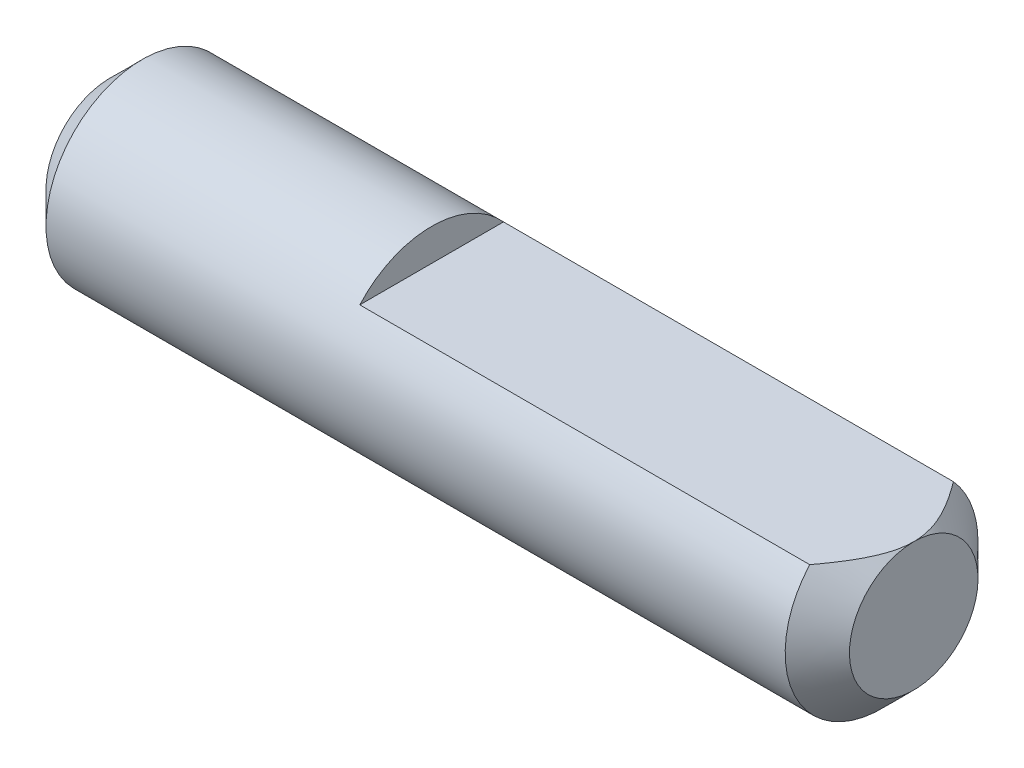
ISO-10303-21;
HEADER;
FILE_DESCRIPTION(('STEP AP214'),'2;1');
FILE_NAME('part.step','',(''),(''),'','','');
FILE_SCHEMA(('AUTOMOTIVE_DESIGN { 1 0 10303 214 1 1 1 1 }'));
ENDSEC;
DATA;
#1=APPLICATION_CONTEXT('core data for automotive mechanical design processes');
#2=APPLICATION_PROTOCOL_DEFINITION('international standard','automotive_design',2000,#1);
#3=PRODUCT_CONTEXT('',#1,'mechanical');
#4=PRODUCT('Part','Part','',(#3));
#5=PRODUCT_RELATED_PRODUCT_CATEGORY('part','',(#4));
#6=PRODUCT_DEFINITION_FORMATION('','',#4);
#7=PRODUCT_DEFINITION_CONTEXT('part definition',#1,'design');
#8=PRODUCT_DEFINITION('design','',#6,#7);
#9=PRODUCT_DEFINITION_SHAPE('','',#8);
#10=(LENGTH_UNIT() NAMED_UNIT(*) SI_UNIT(.MILLI.,.METRE.));
#11=(NAMED_UNIT(*) PLANE_ANGLE_UNIT() SI_UNIT($,.RADIAN.));
#12=(NAMED_UNIT(*) SI_UNIT($,.STERADIAN.) SOLID_ANGLE_UNIT());
#13=UNCERTAINTY_MEASURE_WITH_UNIT(LENGTH_MEASURE(1.E-05),#10,'distance_accuracy_value','');
#14=(GEOMETRIC_REPRESENTATION_CONTEXT(3) GLOBAL_UNCERTAINTY_ASSIGNED_CONTEXT((#13)) GLOBAL_UNIT_ASSIGNED_CONTEXT((#10,
#11,#12)) REPRESENTATION_CONTEXT('',''));
#15=CARTESIAN_POINT('',(0.,0.,0.));
#16=DIRECTION('',(0.,0.,1.));
#17=DIRECTION('',(1.,0.,0.));
#18=AXIS2_PLACEMENT_3D('',#15,#16,#17);
#19=CARTESIAN_POINT('',(-12.5,0.,0.));
#20=DIRECTION('',(-1.,0.,0.));
#21=DIRECTION('',(0.,0.,-1.));
#22=AXIS2_PLACEMENT_3D('',#19,#20,#21);
#23=PLANE('',#22);
#24=CARTESIAN_POINT('',(-12.5,0.,0.));
#25=DIRECTION('',(1.,0.,0.));
#26=DIRECTION('',(0.,0.,-1.));
#27=AXIS2_PLACEMENT_3D('',#24,#25,#26);
#28=CIRCLE('',#27,1.99999999999999);
#29=CARTESIAN_POINT('',(-12.5,0.,-1.99999999999999));
#30=VERTEX_POINT('',#29);
#31=EDGE_CURVE('E85',#30,#30,#28,.T.);
#32=ORIENTED_EDGE('',*,*,#31,.F.);
#33=EDGE_LOOP('',(#32));
#34=FACE_BOUND('',#33,.T.);
#35=ADVANCED_FACE('F41',(#34),#23,.T.);
#36=CARTESIAN_POINT('',(12.5,0.,0.));
#37=DIRECTION('',(-1.,0.,0.));
#38=DIRECTION('',(0.,0.,-1.));
#39=AXIS2_PLACEMENT_3D('',#36,#37,#38);
#40=PLANE('',#39);
#41=CARTESIAN_POINT('',(12.5,0.,0.));
#42=DIRECTION('',(1.,0.,0.));
#43=DIRECTION('',(0.,0.,-1.));
#44=AXIS2_PLACEMENT_3D('',#41,#42,#43);
#45=CIRCLE('',#44,1.99999999999999);
#46=CARTESIAN_POINT('',(12.5,2.,0.));
#47=VERTEX_POINT('',#46);
#48=EDGE_CURVE('E94',#47,#47,#45,.F.);
#49=ORIENTED_EDGE('',*,*,#48,.F.);
#50=EDGE_LOOP('',(#49));
#51=FACE_BOUND('',#50,.T.);
#52=ADVANCED_FACE('F109',(#51),#40,.F.);
#53=CARTESIAN_POINT('',(-12.5,0.,0.));
#54=DIRECTION('',(-1.,0.,0.));
#55=DIRECTION('',(0.,0.,-1.));
#56=AXIS2_PLACEMENT_3D('',#53,#54,#55);
#57=CYLINDRICAL_SURFACE('',#56,3.);
#58=DIRECTION('',(-1.,0.,0.));
#59=VECTOR('',#58,1.);
#60=CARTESIAN_POINT('',(-12.5,2.,2.23606797749979));
#61=LINE('',#60,#59);
#62=CARTESIAN_POINT('',(11.4999999999999,2.,2.23606797749999));
#63=VERTEX_POINT('',#62);
#64=CARTESIAN_POINT('',(-2.5,2.,2.23606797749979));
#65=VERTEX_POINT('',#64);
#66=EDGE_CURVE('E73',#63,#65,#61,.T.);
#67=ORIENTED_EDGE('',*,*,#66,.T.);
#68=CARTESIAN_POINT('',(-2.5,0.,0.));
#69=DIRECTION('',(1.,0.,0.));
#70=DIRECTION('',(0.,0.,-1.));
#71=AXIS2_PLACEMENT_3D('',#68,#69,#70);
#72=CIRCLE('',#71,3.);
#73=CARTESIAN_POINT('',(-2.5,2.,-2.23606797749979));
#74=VERTEX_POINT('',#73);
#75=EDGE_CURVE('E11',#65,#74,#72,.F.);
#76=ORIENTED_EDGE('',*,*,#75,.T.);
#77=DIRECTION('',(-1.,0.,0.));
#78=VECTOR('',#77,1.);
#79=CARTESIAN_POINT('',(-12.5,2.,-2.23606797749979));
#80=LINE('',#79,#78);
#81=CARTESIAN_POINT('',(11.4999999999996,2.,-2.23606797750084));
#82=VERTEX_POINT('',#81);
#83=EDGE_CURVE('E75',#74,#82,#80,.F.);
#84=ORIENTED_EDGE('',*,*,#83,.T.);
#85=CARTESIAN_POINT('',(11.5,0.,0.));
#86=DIRECTION('',(1.,0.,0.));
#87=DIRECTION('',(0.,0.,-1.));
#88=AXIS2_PLACEMENT_3D('',#85,#86,#87);
#89=CIRCLE('',#88,3.);
#90=EDGE_CURVE('E83',#63,#82,#89,.T.);
#91=ORIENTED_EDGE('',*,*,#90,.F.);
#92=EDGE_LOOP('',(#67,#76,#84,#91));
#93=FACE_BOUND('',#92,.T.);
#94=CARTESIAN_POINT('',(-11.5,0.,0.));
#95=DIRECTION('',(1.,0.,0.));
#96=DIRECTION('',(0.,0.,-1.));
#97=AXIS2_PLACEMENT_3D('',#94,#95,#96);
#98=CIRCLE('',#97,3.);
#99=CARTESIAN_POINT('',(-11.5,0.,-3.));
#100=VERTEX_POINT('',#99);
#101=EDGE_CURVE('E91',#100,#100,#98,.F.);
#102=ORIENTED_EDGE('',*,*,#101,.F.);
#103=EDGE_LOOP('',(#102));
#104=FACE_BOUND('',#103,.T.);
#105=ADVANCED_FACE('F81',(#93,#104),#57,.T.);
#106=CARTESIAN_POINT('',(-12.5,0.,0.));
#107=DIRECTION('',(1.,0.,0.));
#108=DIRECTION('',(0.,0.,1.));
#109=AXIS2_PLACEMENT_3D('',#106,#107,#108);
#110=CONICAL_SURFACE('',#109,1.99999999999999,0.785398163397446);
#111=ORIENTED_EDGE('',*,*,#101,.T.);
#112=EDGE_LOOP('',(#111));
#113=FACE_BOUND('',#112,.T.);
#114=ORIENTED_EDGE('',*,*,#31,.T.);
#115=EDGE_LOOP('',(#114));
#116=FACE_BOUND('',#115,.T.);
#117=ADVANCED_FACE('F108',(#113,#116),#110,.T.);
#118=CARTESIAN_POINT('',(11.5,0.,0.));
#119=DIRECTION('',(-1.,0.,0.));
#120=DIRECTION('',(0.,0.,-1.));
#121=AXIS2_PLACEMENT_3D('',#118,#119,#120);
#122=CONICAL_SURFACE('',#121,3.,0.78539816339745);
#123=CARTESIAN_POINT('',(5.41703746970178,2.,-8.86003432988845));
#124=CARTESIAN_POINT('',(5.65772775587966,2.,-8.61326628181268));
#125=CARTESIAN_POINT('',(5.89818932126684,2.,-8.36627412238222));
#126=CARTESIAN_POINT('',(6.37847537945591,2.,-7.87164272525134));
#127=CARTESIAN_POINT('',(6.6182998334215,2.,-7.62400344985071));
#128=CARTESIAN_POINT('',(7.09766753113925,2.,-7.12732372928553));
#129=CARTESIAN_POINT('',(7.33720877992833,2.,-6.87828135734135));
#130=CARTESIAN_POINT('',(7.81511816843588,2.,-6.37909579449285));
#131=CARTESIAN_POINT('',(8.05348636554827,2.,-6.12895265860308));
#132=CARTESIAN_POINT('',(8.53862729701263,2.,-5.61649990414109));
#133=CARTESIAN_POINT('',(8.7853291560252,2.,-5.35412312822613));
#134=CARTESIAN_POINT('',(9.27611212193805,2.,-4.82684278662519));
#135=CARTESIAN_POINT('',(9.52019282034569,2.,-4.56193883890144));
#136=CARTESIAN_POINT('',(9.88292375229358,2.,-4.16179105350155));
#137=CARTESIAN_POINT('',(10.0031996958733,2.,-4.02802218949267));
#138=CARTESIAN_POINT('',(10.2423168430769,2.,-3.75920971084084));
#139=CARTESIAN_POINT('',(10.3611580738999,2.,-3.62416612045073));
#140=CARTESIAN_POINT('',(10.5968866585208,2.,-3.35244082891347));
#141=CARTESIAN_POINT('',(10.7137744962098,2.,-3.21575954830017));
#142=CARTESIAN_POINT('',(10.9448790700268,2.,-2.94016178485181));
#143=CARTESIAN_POINT('',(11.0590960369023,2.,-2.80124549687175));
#144=CARTESIAN_POINT('',(11.2134470954143,2.,-2.60814461422931));
#145=CARTESIAN_POINT('',(11.2552476939882,2.,-2.55529185212358));
#146=CARTESIAN_POINT('',(11.3382090653509,2.,-2.44908586095818));
#147=CARTESIAN_POINT('',(11.3793698296002,2.,-2.39573262523426));
#148=CARTESIAN_POINT('',(11.5017621522644,2.,-2.23479455060442));
#149=CARTESIAN_POINT('',(11.5818831700971,2.,-2.12635689306305));
#150=CARTESIAN_POINT('',(11.7378134006537,2.,-1.90673708759311));
#151=CARTESIAN_POINT('',(11.8136310124631,2.,-1.79556093890677));
#152=CARTESIAN_POINT('',(11.9592648130628,2.,-1.56934886975337));
#153=CARTESIAN_POINT('',(12.0290838591124,2.,-1.45431482360752));
#154=CARTESIAN_POINT('',(12.130385368316,2.,-1.27198493066234));
#155=CARTESIAN_POINT('',(12.1650047648803,2.,-1.20644698594879));
#156=CARTESIAN_POINT('',(12.230766898565,2.,-1.07366673449259));
#157=CARTESIAN_POINT('',(12.2619093348087,2.,-1.00642428086809));
#158=CARTESIAN_POINT('',(12.348677331037,2.,-0.802077686015743));
#159=CARTESIAN_POINT('',(12.3978656324703,2.,-0.661975190878664));
#160=CARTESIAN_POINT('',(12.4482825520442,2.,-0.461135646716724));
#161=CARTESIAN_POINT('',(12.4605900319976,2.,-0.403129036486597));
#162=CARTESIAN_POINT('',(12.4804283252132,2.,-0.28631420468672));
#163=CARTESIAN_POINT('',(12.4879614987479,2.,-0.227506393918163));
#164=CARTESIAN_POINT('',(12.4978620338104,2.,-0.109558488665088));
#165=CARTESIAN_POINT('',(12.5002385683149,2.,-0.0504191721513691));
#166=CARTESIAN_POINT('',(12.4997235027777,2.,0.0678384914660358));
#167=CARTESIAN_POINT('',(12.4968317495754,2.,0.126956837910099));
#168=CARTESIAN_POINT('',(12.4859567501784,2.,0.244510879048098));
#169=CARTESIAN_POINT('',(12.4779910262056,2.,0.302948221036442));
#170=CARTESIAN_POINT('',(12.457380920399,2.,0.41899444563337));
#171=CARTESIAN_POINT('',(12.4447354297561,2.,0.476603128538789));
#172=CARTESIAN_POINT('',(12.4152693597724,2.,0.590898805262331));
#173=CARTESIAN_POINT('',(12.3984374104437,2.,0.64758283355783));
#174=CARTESIAN_POINT('',(12.3612099218623,2.,0.759751791832215));
#175=CARTESIAN_POINT('',(12.3408145343484,2.,0.815236772756141));
#176=CARTESIAN_POINT('',(12.2879608282142,2.,0.947727233807935));
#177=CARTESIAN_POINT('',(12.2540040015544,2.,1.02413301767514));
#178=CARTESIAN_POINT('',(12.1814592727722,2.,1.17472930717663));
#179=CARTESIAN_POINT('',(12.142868803118,2.,1.24891855591839));
#180=CARTESIAN_POINT('',(12.062053667377,2.,1.3954657814648));
#181=CARTESIAN_POINT('',(12.0198220005083,2.,1.46781986812049));
#182=CARTESIAN_POINT('',(11.932588859845,2.,1.61084154933759));
#183=CARTESIAN_POINT('',(11.8875869724692,2.,1.6815088898794));
#184=CARTESIAN_POINT('',(11.7947414327508,2.,1.82243628031244));
#185=CARTESIAN_POINT('',(11.7468657769217,2.,1.8926751476593));
#186=CARTESIAN_POINT('',(11.6493489269364,2.,2.03191523170228));
#187=CARTESIAN_POINT('',(11.5997076704431,2.,2.10091640457012));
#188=CARTESIAN_POINT('',(11.4990773821634,2.,2.23778591963137));
#189=CARTESIAN_POINT('',(11.4480902132908,2.,2.30565563523325));
#190=CARTESIAN_POINT('',(11.3449692411205,2.,2.44051239160787));
#191=CARTESIAN_POINT('',(11.292835476495,2.,2.50749946202879));
#192=CARTESIAN_POINT('',(11.1232507476965,2.,2.72226884836498));
#193=CARTESIAN_POINT('',(11.0039525442269,2.,2.86859218788451));
#194=CARTESIAN_POINT('',(10.7622538964127,2.,3.15866002674973));
#195=CARTESIAN_POINT('',(10.6398531075473,2.,3.30240423664722));
#196=CARTESIAN_POINT('',(10.3928234816083,2.,3.58804149156583));
#197=CARTESIAN_POINT('',(10.2681939474629,2.,3.72993393254005));
#198=CARTESIAN_POINT('',(10.017329582773,2.,4.01229443801337));
#199=CARTESIAN_POINT('',(9.89109471582817,2.,4.15276247008415));
#200=CARTESIAN_POINT('',(9.5101641473369,2.,4.57303156086122));
#201=CARTESIAN_POINT('',(9.25367422062177,2.,4.85120466112473));
#202=CARTESIAN_POINT('',(8.73787881132942,2.,5.40481331464448));
#203=CARTESIAN_POINT('',(8.47857388539581,2.,5.68024938921235));
#204=CARTESIAN_POINT('',(7.98660997655898,2.,6.19921659830033));
#205=CARTESIAN_POINT('',(7.75414738426389,2.,6.44293407084752));
#206=CARTESIAN_POINT('',(7.28813095964181,2.,6.92935046958473));
#207=CARTESIAN_POINT('',(7.05457706255781,2.,7.17204933366686));
#208=CARTESIAN_POINT('',(6.58735875199387,2.,7.65596926208179));
#209=CARTESIAN_POINT('',(6.35369666350206,2.,7.89719257267554));
#210=CARTESIAN_POINT('',(5.88577496049427,2.,8.37902662777462));
#211=CARTESIAN_POINT('',(5.65151538850262,2.,8.61963741356644));
#212=CARTESIAN_POINT('',(5.41703746970178,2.,8.86003432988845));
#213=B_SPLINE_CURVE_WITH_KNOTS('',3,(#123,#124,#125,#126,#127,#128,#129,#130,#131,#132,#133,
#134,#135,#136,#137,#138,#139,#140,#141,#142,#143,#144,#145,#146,#147,#148,#149,#150,#151,#152,
#153,#154,#155,#156,#157,#158,#159,#160,#161,#162,#163,#164,#165,#166,#167,#168,#169,#170,#171,
#172,#173,#174,#175,#176,#177,#178,#179,#180,#181,#182,#183,#184,#185,#186,#187,#188,#189,#190,
#191,#192,#193,#194,#195,#196,#197,#198,#199,#200,#201,#202,#203,#204,#205,#206,#207,#208,#209,
#210,#211,#212),.UNSPECIFIED.,.F.,.F.,(4,2,2,2,2,2,2,2,2,2,2,2,2,2,2,2,2,2,2,2,2,2,2,2,2,2,2,2,
2,2,2,2,2,2,2,2,2,2,2,2,2,2,2,2,4),(0.,1.03413662075917,2.06833489563741,3.10497064258256,
4.14155515546503,5.22197638861575,6.30256362442557,6.84222642641263,7.3818789814386,
7.92139581157559,8.46086585711346,8.66301571388498,8.86516826629999,9.26957174594646,
9.67315669128106,10.076548321242,10.2988071281946,10.5210851533016,10.9643291236505,
11.1420628138381,11.3197085691929,11.4970380563588,11.6743726989632,11.8510982379089,
12.0278656764793,12.2051185420217,12.382363861591,12.6329835111957,12.8837426772573,
13.1349952037894,13.3862853325664,13.6412618216769,13.896247322065,14.150896697606,
14.4055374975173,14.9718400725797,15.538205809547,16.1047518958526,16.6713108514056,
17.8063943211659,18.9412572839372,19.9516651237309,20.962133701529,21.9696442456258,
22.9770849794664),.UNSPECIFIED.);
#214=EDGE_CURVE('E50',#82,#47,#213,.T.);
#215=ORIENTED_EDGE('',*,*,#214,.T.);
#216=ORIENTED_EDGE('',*,*,#48,.T.);
#217=EDGE_CURVE('E57',#47,#63,#213,.T.);
#218=ORIENTED_EDGE('',*,*,#217,.T.);
#219=ORIENTED_EDGE('',*,*,#90,.T.);
#220=EDGE_LOOP('',(#215,#216,#218,#219));
#221=FACE_BOUND('',#220,.T.);
#222=ADVANCED_FACE('F43',(#221),#122,.T.);
#223=CARTESIAN_POINT('',(12.5,2.,3.));
#224=DIRECTION('',(0.,-1.,0.));
#225=DIRECTION('',(1.,0.,0.));
#226=AXIS2_PLACEMENT_3D('',#223,#224,#225);
#227=PLANE('',#226);
#228=ORIENTED_EDGE('',*,*,#83,.F.);
#229=DIRECTION('',(0.,0.,-1.));
#230=VECTOR('',#229,1.);
#231=CARTESIAN_POINT('',(-2.5,2.,3.));
#232=LINE('',#231,#230);
#233=EDGE_CURVE('E69',#65,#74,#232,.T.);
#234=ORIENTED_EDGE('',*,*,#233,.F.);
#235=ORIENTED_EDGE('',*,*,#66,.F.);
#236=ORIENTED_EDGE('',*,*,#217,.F.);
#237=ORIENTED_EDGE('',*,*,#214,.F.);
#238=EDGE_LOOP('',(#228,#234,#235,#236,#237));
#239=FACE_BOUND('',#238,.T.);
#240=ADVANCED_FACE('F71',(#239),#227,.F.);
#241=CARTESIAN_POINT('',(-2.5,2.,3.));
#242=DIRECTION('',(-1.,0.,0.));
#243=DIRECTION('',(0.,0.,-1.));
#244=AXIS2_PLACEMENT_3D('',#241,#242,#243);
#245=PLANE('',#244);
#246=ORIENTED_EDGE('',*,*,#233,.T.);
#247=ORIENTED_EDGE('',*,*,#75,.F.);
#248=EDGE_LOOP('',(#246,#247));
#249=FACE_BOUND('',#248,.T.);
#250=ADVANCED_FACE('F78',(#249),#245,.F.);
#251=CLOSED_SHELL('',(#35,#52,#105,#117,#222,#240,#250));
#252=MANIFOLD_SOLID_BREP('B2',#251);
#253=ADVANCED_BREP_SHAPE_REPRESENTATION('',(#18,#252),#14);
#254=SHAPE_DEFINITION_REPRESENTATION(#9,#253);
ENDSEC;
END-ISO-10303-21;
